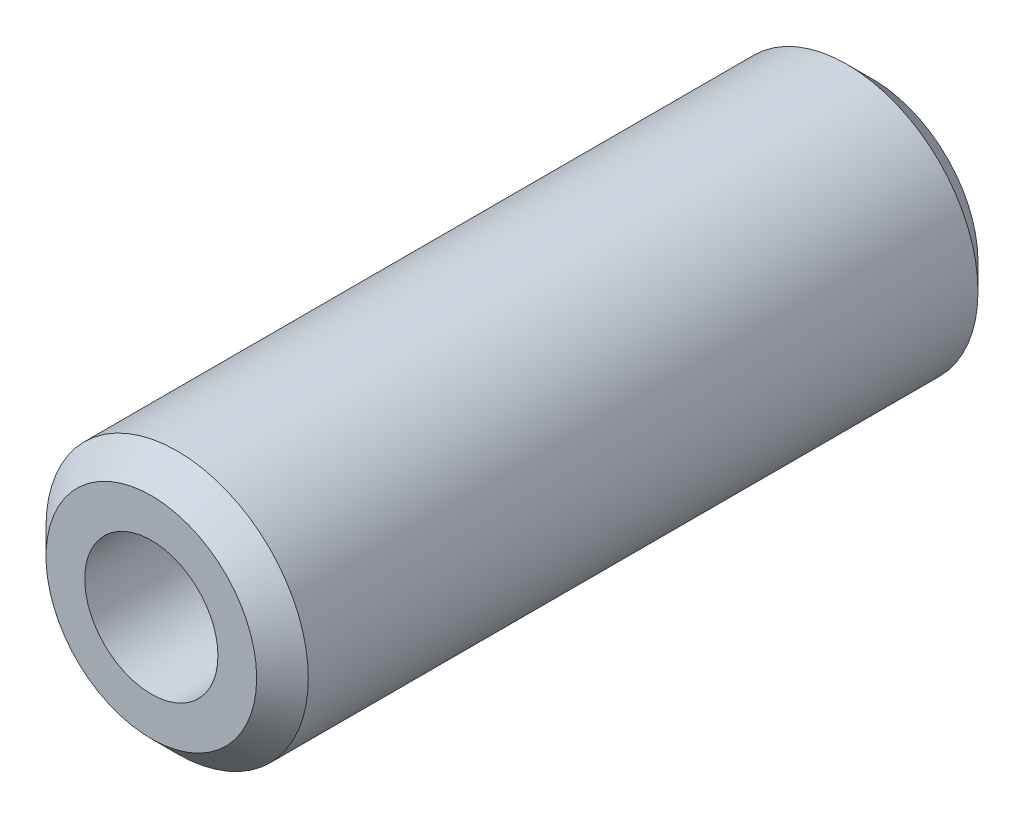
ISO-10303-21;
HEADER;
FILE_DESCRIPTION(('STEP AP214'),'2;1');
FILE_NAME('part.step','',(''),(''),'','','');
FILE_SCHEMA(('AUTOMOTIVE_DESIGN { 1 0 10303 214 1 1 1 1 }'));
ENDSEC;
DATA;
#1=APPLICATION_CONTEXT('core data for automotive mechanical design processes');
#2=APPLICATION_PROTOCOL_DEFINITION('international standard','automotive_design',2000,#1);
#3=PRODUCT_CONTEXT('',#1,'mechanical');
#4=PRODUCT('Part','Part','',(#3));
#5=PRODUCT_RELATED_PRODUCT_CATEGORY('part','',(#4));
#6=PRODUCT_DEFINITION_FORMATION('','',#4);
#7=PRODUCT_DEFINITION_CONTEXT('part definition',#1,'design');
#8=PRODUCT_DEFINITION('design','',#6,#7);
#9=PRODUCT_DEFINITION_SHAPE('','',#8);
#10=(LENGTH_UNIT() NAMED_UNIT(*) SI_UNIT(.MILLI.,.METRE.));
#11=(NAMED_UNIT(*) PLANE_ANGLE_UNIT() SI_UNIT($,.RADIAN.));
#12=(NAMED_UNIT(*) SI_UNIT($,.STERADIAN.) SOLID_ANGLE_UNIT());
#13=UNCERTAINTY_MEASURE_WITH_UNIT(LENGTH_MEASURE(1.E-05),#10,'distance_accuracy_value','');
#14=(GEOMETRIC_REPRESENTATION_CONTEXT(3) GLOBAL_UNCERTAINTY_ASSIGNED_CONTEXT((#13)) GLOBAL_UNIT_ASSIGNED_CONTEXT((#10,
#11,#12)) REPRESENTATION_CONTEXT('',''));
#15=CARTESIAN_POINT('',(0.,0.,0.));
#16=DIRECTION('',(0.,0.,1.));
#17=DIRECTION('',(1.,0.,0.));
#18=AXIS2_PLACEMENT_3D('',#15,#16,#17);
#19=CARTESIAN_POINT('',(0.,0.,69.85));
#20=DIRECTION('',(0.,0.,-1.));
#21=DIRECTION('',(-1.,0.,0.));
#22=AXIS2_PLACEMENT_3D('',#19,#20,#21);
#23=CYLINDRICAL_SURFACE('',#22,12.7);
#24=CARTESIAN_POINT('',(0.,0.,67.35));
#25=DIRECTION('',(0.,0.,1.));
#26=DIRECTION('',(1.,0.,0.));
#27=AXIS2_PLACEMENT_3D('',#24,#25,#26);
#28=CIRCLE('',#27,12.7);
#29=CARTESIAN_POINT('',(12.7,0.,67.35));
#30=VERTEX_POINT('',#29);
#31=EDGE_CURVE('E52',#30,#30,#28,.F.);
#32=ORIENTED_EDGE('',*,*,#31,.T.);
#33=EDGE_LOOP('',(#32));
#34=FACE_BOUND('',#33,.T.);
#35=CARTESIAN_POINT('',(0.,0.,2.5));
#36=DIRECTION('',(0.,0.,1.));
#37=DIRECTION('',(1.,0.,0.));
#38=AXIS2_PLACEMENT_3D('',#35,#36,#37);
#39=CIRCLE('',#38,12.7);
#40=CARTESIAN_POINT('',(12.7,0.,2.5));
#41=VERTEX_POINT('',#40);
#42=EDGE_CURVE('E57',#41,#41,#39,.T.);
#43=ORIENTED_EDGE('',*,*,#42,.T.);
#44=EDGE_LOOP('',(#43));
#45=FACE_BOUND('',#44,.T.);
#46=ADVANCED_FACE('F43',(#34,#45),#23,.T.);
#47=CARTESIAN_POINT('',(0.,0.,69.85));
#48=DIRECTION('',(0.,0.,1.));
#49=DIRECTION('',(1.,0.,0.));
#50=AXIS2_PLACEMENT_3D('',#47,#48,#49);
#51=PLANE('',#50);
#52=CARTESIAN_POINT('',(0.,0.,69.85));
#53=DIRECTION('',(0.,0.,1.));
#54=DIRECTION('',(1.,0.,0.));
#55=AXIS2_PLACEMENT_3D('',#52,#53,#54);
#56=CIRCLE('',#55,10.2);
#57=CARTESIAN_POINT('',(10.2,0.,69.85));
#58=VERTEX_POINT('',#57);
#59=EDGE_CURVE('E62',#58,#58,#56,.T.);
#60=ORIENTED_EDGE('',*,*,#59,.T.);
#61=EDGE_LOOP('',(#60));
#62=FACE_BOUND('',#61,.T.);
#63=CARTESIAN_POINT('',(0.,0.,69.85));
#64=DIRECTION('',(0.,0.,1.));
#65=DIRECTION('',(1.,0.,0.));
#66=AXIS2_PLACEMENT_3D('',#63,#64,#65);
#67=CIRCLE('',#66,6.45);
#68=CARTESIAN_POINT('',(6.45,0.,69.85));
#69=VERTEX_POINT('',#68);
#70=EDGE_CURVE('E69',#69,#69,#67,.T.);
#71=ORIENTED_EDGE('',*,*,#70,.F.);
#72=EDGE_LOOP('',(#71));
#73=FACE_BOUND('',#72,.T.);
#74=ADVANCED_FACE('F86',(#62,#73),#51,.T.);
#75=CARTESIAN_POINT('',(0.,0.,0.));
#76=DIRECTION('',(0.,0.,1.));
#77=DIRECTION('',(1.,0.,0.));
#78=AXIS2_PLACEMENT_3D('',#75,#76,#77);
#79=PLANE('',#78);
#80=CARTESIAN_POINT('',(0.,0.,0.));
#81=DIRECTION('',(0.,0.,1.));
#82=DIRECTION('',(1.,0.,0.));
#83=AXIS2_PLACEMENT_3D('',#80,#81,#82);
#84=CIRCLE('',#83,10.2);
#85=CARTESIAN_POINT('',(10.2,0.,0.));
#86=VERTEX_POINT('',#85);
#87=EDGE_CURVE('E10',#86,#86,#84,.F.);
#88=ORIENTED_EDGE('',*,*,#87,.T.);
#89=EDGE_LOOP('',(#88));
#90=FACE_BOUND('',#89,.T.);
#91=CARTESIAN_POINT('',(0.,0.,0.));
#92=DIRECTION('',(0.,0.,1.));
#93=DIRECTION('',(1.,0.,0.));
#94=AXIS2_PLACEMENT_3D('',#91,#92,#93);
#95=CIRCLE('',#94,6.45);
#96=CARTESIAN_POINT('',(6.45,0.,0.));
#97=VERTEX_POINT('',#96);
#98=EDGE_CURVE('E68',#97,#97,#95,.T.);
#99=ORIENTED_EDGE('',*,*,#98,.T.);
#100=EDGE_LOOP('',(#99));
#101=FACE_BOUND('',#100,.T.);
#102=ADVANCED_FACE('F77',(#90,#101),#79,.F.);
#103=CARTESIAN_POINT('',(0.,0.,0.));
#104=DIRECTION('',(0.,0.,1.));
#105=DIRECTION('',(1.,0.,0.));
#106=AXIS2_PLACEMENT_3D('',#103,#104,#105);
#107=CYLINDRICAL_SURFACE('',#106,6.45);
#108=ORIENTED_EDGE('',*,*,#98,.F.);
#109=EDGE_LOOP('',(#108));
#110=FACE_BOUND('',#109,.T.);
#111=ORIENTED_EDGE('',*,*,#70,.T.);
#112=EDGE_LOOP('',(#111));
#113=FACE_BOUND('',#112,.T.);
#114=ADVANCED_FACE('F79',(#110,#113),#107,.F.);
#115=CARTESIAN_POINT('',(0.,0.,69.85));
#116=DIRECTION('',(0.,0.,-1.));
#117=DIRECTION('',(-1.,0.,0.));
#118=AXIS2_PLACEMENT_3D('',#115,#116,#117);
#119=CONICAL_SURFACE('',#118,10.2,0.785398163397448);
#120=ORIENTED_EDGE('',*,*,#31,.F.);
#121=EDGE_LOOP('',(#120));
#122=FACE_BOUND('',#121,.T.);
#123=ORIENTED_EDGE('',*,*,#59,.F.);
#124=EDGE_LOOP('',(#123));
#125=FACE_BOUND('',#124,.T.);
#126=ADVANCED_FACE('F82',(#122,#125),#119,.T.);
#127=CARTESIAN_POINT('',(0.,0.,2.5));
#128=DIRECTION('',(0.,0.,1.));
#129=DIRECTION('',(1.,0.,0.));
#130=AXIS2_PLACEMENT_3D('',#127,#128,#129);
#131=CONICAL_SURFACE('',#130,12.7,0.785398163397453);
#132=ORIENTED_EDGE('',*,*,#87,.F.);
#133=EDGE_LOOP('',(#132));
#134=FACE_BOUND('',#133,.T.);
#135=ORIENTED_EDGE('',*,*,#42,.F.);
#136=EDGE_LOOP('',(#135));
#137=FACE_BOUND('',#136,.T.);
#138=ADVANCED_FACE('F46',(#134,#137),#131,.T.);
#139=CLOSED_SHELL('',(#46,#74,#102,#114,#126,#138));
#140=MANIFOLD_SOLID_BREP('B2',#139);
#141=ADVANCED_BREP_SHAPE_REPRESENTATION('',(#18,#140),#14);
#142=SHAPE_DEFINITION_REPRESENTATION(#9,#141);
ENDSEC;
END-ISO-10303-21;
